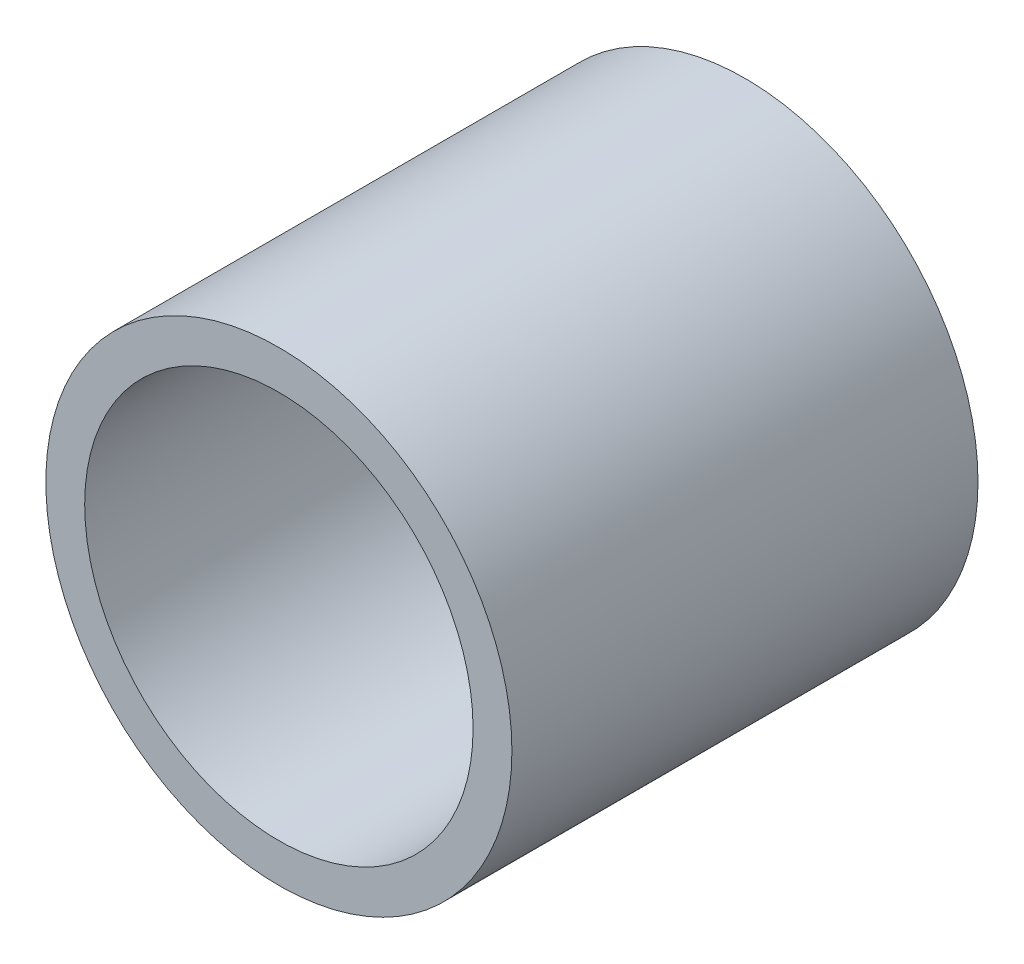
ISO-10303-21;
HEADER;
FILE_DESCRIPTION(('STEP AP214'),'2;1');
FILE_NAME('part.step','',(''),(''),'','','');
FILE_SCHEMA(('AUTOMOTIVE_DESIGN { 1 0 10303 214 1 1 1 1 }'));
ENDSEC;
DATA;
#1=APPLICATION_CONTEXT('core data for automotive mechanical design processes');
#2=APPLICATION_PROTOCOL_DEFINITION('international standard','automotive_design',2000,#1);
#3=PRODUCT_CONTEXT('',#1,'mechanical');
#4=PRODUCT('Part','Part','',(#3));
#5=PRODUCT_RELATED_PRODUCT_CATEGORY('part','',(#4));
#6=PRODUCT_DEFINITION_FORMATION('','',#4);
#7=PRODUCT_DEFINITION_CONTEXT('part definition',#1,'design');
#8=PRODUCT_DEFINITION('design','',#6,#7);
#9=PRODUCT_DEFINITION_SHAPE('','',#8);
#10=(LENGTH_UNIT() NAMED_UNIT(*) SI_UNIT(.MILLI.,.METRE.));
#11=(NAMED_UNIT(*) PLANE_ANGLE_UNIT() SI_UNIT($,.RADIAN.));
#12=(NAMED_UNIT(*) SI_UNIT($,.STERADIAN.) SOLID_ANGLE_UNIT());
#13=UNCERTAINTY_MEASURE_WITH_UNIT(LENGTH_MEASURE(1.E-05),#10,'distance_accuracy_value','');
#14=(GEOMETRIC_REPRESENTATION_CONTEXT(3) GLOBAL_UNCERTAINTY_ASSIGNED_CONTEXT((#13)) GLOBAL_UNIT_ASSIGNED_CONTEXT((#10,
#11,#12)) REPRESENTATION_CONTEXT('',''));
#15=CARTESIAN_POINT('',(0.,0.,0.));
#16=DIRECTION('',(0.,0.,1.));
#17=DIRECTION('',(1.,0.,0.));
#18=AXIS2_PLACEMENT_3D('',#15,#16,#17);
#19=CARTESIAN_POINT('',(0.,0.,12.));
#20=DIRECTION('',(0.,0.,1.));
#21=DIRECTION('',(1.,0.,0.));
#22=AXIS2_PLACEMENT_3D('',#19,#20,#21);
#23=PLANE('',#22);
#24=CARTESIAN_POINT('',(0.,0.,12.));
#25=DIRECTION('',(0.,0.,1.));
#26=DIRECTION('',(1.,0.,0.));
#27=AXIS2_PLACEMENT_3D('',#24,#25,#26);
#28=CIRCLE('',#27,6.);
#29=CARTESIAN_POINT('',(6.,0.,12.));
#30=VERTEX_POINT('',#29);
#31=EDGE_CURVE('E10',#30,#30,#28,.T.);
#32=ORIENTED_EDGE('',*,*,#31,.T.);
#33=EDGE_LOOP('',(#32));
#34=FACE_BOUND('',#33,.T.);
#35=CARTESIAN_POINT('',(0.,0.,12.));
#36=DIRECTION('',(0.,0.,1.));
#37=DIRECTION('',(1.,0.,0.));
#38=AXIS2_PLACEMENT_3D('',#35,#36,#37);
#39=CIRCLE('',#38,5.);
#40=CARTESIAN_POINT('',(5.,0.,12.));
#41=VERTEX_POINT('',#40);
#42=EDGE_CURVE('E50',#41,#41,#39,.T.);
#43=ORIENTED_EDGE('',*,*,#42,.F.);
#44=EDGE_LOOP('',(#43));
#45=FACE_BOUND('',#44,.T.);
#46=ADVANCED_FACE('F37',(#34,#45),#23,.T.);
#47=CARTESIAN_POINT('',(0.,0.,0.));
#48=DIRECTION('',(0.,0.,1.));
#49=DIRECTION('',(1.,0.,0.));
#50=AXIS2_PLACEMENT_3D('',#47,#48,#49);
#51=PLANE('',#50);
#52=CARTESIAN_POINT('',(0.,0.,0.));
#53=DIRECTION('',(0.,0.,1.));
#54=DIRECTION('',(1.,0.,0.));
#55=AXIS2_PLACEMENT_3D('',#52,#53,#54);
#56=CIRCLE('',#55,6.);
#57=CARTESIAN_POINT('',(6.,0.,0.));
#58=VERTEX_POINT('',#57);
#59=EDGE_CURVE('E41',#58,#58,#56,.T.);
#60=ORIENTED_EDGE('',*,*,#59,.F.);
#61=EDGE_LOOP('',(#60));
#62=FACE_BOUND('',#61,.T.);
#63=CARTESIAN_POINT('',(0.,0.,0.));
#64=DIRECTION('',(0.,0.,1.));
#65=DIRECTION('',(1.,0.,0.));
#66=AXIS2_PLACEMENT_3D('',#63,#64,#65);
#67=CIRCLE('',#66,5.);
#68=CARTESIAN_POINT('',(5.,0.,0.));
#69=VERTEX_POINT('',#68);
#70=EDGE_CURVE('E52',#69,#69,#67,.T.);
#71=ORIENTED_EDGE('',*,*,#70,.T.);
#72=EDGE_LOOP('',(#71));
#73=FACE_BOUND('',#72,.T.);
#74=ADVANCED_FACE('F64',(#62,#73),#51,.F.);
#75=CARTESIAN_POINT('',(0.,0.,12.));
#76=DIRECTION('',(0.,0.,-1.));
#77=DIRECTION('',(-1.,0.,0.));
#78=AXIS2_PLACEMENT_3D('',#75,#76,#77);
#79=CYLINDRICAL_SURFACE('',#78,6.);
#80=ORIENTED_EDGE('',*,*,#31,.F.);
#81=EDGE_LOOP('',(#80));
#82=FACE_BOUND('',#81,.T.);
#83=ORIENTED_EDGE('',*,*,#59,.T.);
#84=EDGE_LOOP('',(#83));
#85=FACE_BOUND('',#84,.T.);
#86=ADVANCED_FACE('F39',(#82,#85),#79,.T.);
#87=CARTESIAN_POINT('',(0.,0.,12.));
#88=DIRECTION('',(0.,0.,-1.));
#89=DIRECTION('',(-1.,0.,0.));
#90=AXIS2_PLACEMENT_3D('',#87,#88,#89);
#91=CYLINDRICAL_SURFACE('',#90,5.);
#92=ORIENTED_EDGE('',*,*,#42,.T.);
#93=EDGE_LOOP('',(#92));
#94=FACE_BOUND('',#93,.T.);
#95=ORIENTED_EDGE('',*,*,#70,.F.);
#96=EDGE_LOOP('',(#95));
#97=FACE_BOUND('',#96,.T.);
#98=ADVANCED_FACE('F60',(#94,#97),#91,.F.);
#99=CLOSED_SHELL('',(#46,#74,#86,#98));
#100=MANIFOLD_SOLID_BREP('B2',#99);
#101=ADVANCED_BREP_SHAPE_REPRESENTATION('',(#18,#100),#14);
#102=SHAPE_DEFINITION_REPRESENTATION(#9,#101);
ENDSEC;
END-ISO-10303-21;
